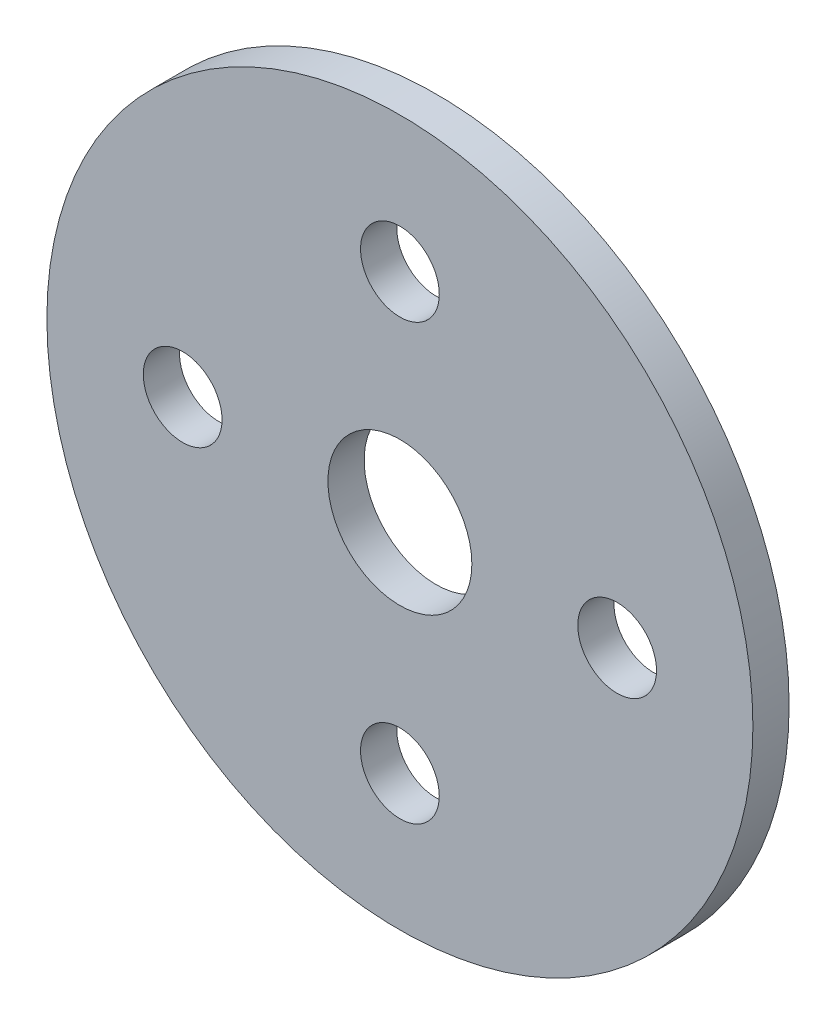
ISO-10303-21;
HEADER;
FILE_DESCRIPTION(('STEP AP214'),'2;1');
FILE_NAME('part.step','',(''),(''),'','','');
FILE_SCHEMA(('AUTOMOTIVE_DESIGN { 1 0 10303 214 1 1 1 1 }'));
ENDSEC;
DATA;
#1=APPLICATION_CONTEXT('core data for automotive mechanical design processes');
#2=APPLICATION_PROTOCOL_DEFINITION('international standard','automotive_design',2000,#1);
#3=PRODUCT_CONTEXT('',#1,'mechanical');
#4=PRODUCT('Part','Part','',(#3));
#5=PRODUCT_RELATED_PRODUCT_CATEGORY('part','',(#4));
#6=PRODUCT_DEFINITION_FORMATION('','',#4);
#7=PRODUCT_DEFINITION_CONTEXT('part definition',#1,'design');
#8=PRODUCT_DEFINITION('design','',#6,#7);
#9=PRODUCT_DEFINITION_SHAPE('','',#8);
#10=(LENGTH_UNIT() NAMED_UNIT(*) SI_UNIT(.MILLI.,.METRE.));
#11=(NAMED_UNIT(*) PLANE_ANGLE_UNIT() SI_UNIT($,.RADIAN.));
#12=(NAMED_UNIT(*) SI_UNIT($,.STERADIAN.) SOLID_ANGLE_UNIT());
#13=UNCERTAINTY_MEASURE_WITH_UNIT(LENGTH_MEASURE(1.E-05),#10,'distance_accuracy_value','');
#14=(GEOMETRIC_REPRESENTATION_CONTEXT(3) GLOBAL_UNCERTAINTY_ASSIGNED_CONTEXT((#13)) GLOBAL_UNIT_ASSIGNED_CONTEXT((#10,
#11,#12)) REPRESENTATION_CONTEXT('',''));
#15=CARTESIAN_POINT('',(0.,0.,0.));
#16=DIRECTION('',(0.,0.,1.));
#17=DIRECTION('',(1.,0.,0.));
#18=AXIS2_PLACEMENT_3D('',#15,#16,#17);
#19=CARTESIAN_POINT('',(0.,0.,2.));
#20=DIRECTION('',(0.,0.,1.));
#21=DIRECTION('',(1.,0.,0.));
#22=AXIS2_PLACEMENT_3D('',#19,#20,#21);
#23=PLANE('',#22);
#24=CARTESIAN_POINT('',(-12.,0.,2.));
#25=DIRECTION('',(0.,0.,1.));
#26=DIRECTION('',(1.,0.,0.));
#27=AXIS2_PLACEMENT_3D('',#24,#25,#26);
#28=CIRCLE('',#27,2.175);
#29=CARTESIAN_POINT('',(-9.825,0.,2.));
#30=VERTEX_POINT('',#29);
#31=EDGE_CURVE('E59',#30,#30,#28,.T.);
#32=ORIENTED_EDGE('',*,*,#31,.F.);
#33=EDGE_LOOP('',(#32));
#34=FACE_BOUND('',#33,.T.);
#35=CARTESIAN_POINT('',(12.,0.,2.));
#36=DIRECTION('',(0.,0.,1.));
#37=DIRECTION('',(1.,0.,0.));
#38=AXIS2_PLACEMENT_3D('',#35,#36,#37);
#39=CIRCLE('',#38,2.175);
#40=CARTESIAN_POINT('',(14.175,0.,2.));
#41=VERTEX_POINT('',#40);
#42=EDGE_CURVE('E47',#41,#41,#39,.T.);
#43=ORIENTED_EDGE('',*,*,#42,.F.);
#44=EDGE_LOOP('',(#43));
#45=FACE_BOUND('',#44,.T.);
#46=CARTESIAN_POINT('',(0.,0.,2.));
#47=DIRECTION('',(0.,0.,1.));
#48=DIRECTION('',(1.,0.,0.));
#49=AXIS2_PLACEMENT_3D('',#46,#47,#48);
#50=CIRCLE('',#49,19.5);
#51=CARTESIAN_POINT('',(19.5,0.,2.));
#52=VERTEX_POINT('',#51);
#53=EDGE_CURVE('E10',#52,#52,#50,.T.);
#54=ORIENTED_EDGE('',*,*,#53,.T.);
#55=EDGE_LOOP('',(#54));
#56=FACE_BOUND('',#55,.T.);
#57=CARTESIAN_POINT('',(0.,0.,2.));
#58=DIRECTION('',(0.,0.,1.));
#59=DIRECTION('',(1.,0.,0.));
#60=AXIS2_PLACEMENT_3D('',#57,#58,#59);
#61=CIRCLE('',#60,3.975);
#62=CARTESIAN_POINT('',(3.975,0.,2.));
#63=VERTEX_POINT('',#62);
#64=EDGE_CURVE('E42',#63,#63,#61,.T.);
#65=ORIENTED_EDGE('',*,*,#64,.F.);
#66=EDGE_LOOP('',(#65));
#67=FACE_BOUND('',#66,.T.);
#68=CARTESIAN_POINT('',(0.,12.,2.));
#69=DIRECTION('',(0.,0.,1.));
#70=DIRECTION('',(1.,0.,0.));
#71=AXIS2_PLACEMENT_3D('',#68,#69,#70);
#72=CIRCLE('',#71,2.175);
#73=CARTESIAN_POINT('',(2.175,12.,2.));
#74=VERTEX_POINT('',#73);
#75=EDGE_CURVE('E53',#74,#74,#72,.T.);
#76=ORIENTED_EDGE('',*,*,#75,.F.);
#77=EDGE_LOOP('',(#76));
#78=FACE_BOUND('',#77,.T.);
#79=CARTESIAN_POINT('',(0.,-12.,2.));
#80=DIRECTION('',(0.,0.,1.));
#81=DIRECTION('',(1.,0.,0.));
#82=AXIS2_PLACEMENT_3D('',#79,#80,#81);
#83=CIRCLE('',#82,2.175);
#84=CARTESIAN_POINT('',(2.175,-12.,2.));
#85=VERTEX_POINT('',#84);
#86=EDGE_CURVE('E65',#85,#85,#83,.T.);
#87=ORIENTED_EDGE('',*,*,#86,.F.);
#88=EDGE_LOOP('',(#87));
#89=FACE_BOUND('',#88,.T.);
#90=ADVANCED_FACE('F31',(#34,#45,#56,#67,#78,#89),#23,.T.);
#91=CARTESIAN_POINT('',(0.,0.,0.));
#92=DIRECTION('',(0.,0.,1.));
#93=DIRECTION('',(1.,0.,0.));
#94=AXIS2_PLACEMENT_3D('',#91,#92,#93);
#95=PLANE('',#94);
#96=CARTESIAN_POINT('',(0.,0.,0.));
#97=DIRECTION('',(0.,0.,1.));
#98=DIRECTION('',(1.,0.,0.));
#99=AXIS2_PLACEMENT_3D('',#96,#97,#98);
#100=CIRCLE('',#99,19.5);
#101=CARTESIAN_POINT('',(19.5,0.,0.));
#102=VERTEX_POINT('',#101);
#103=EDGE_CURVE('E35',#102,#102,#100,.T.);
#104=ORIENTED_EDGE('',*,*,#103,.F.);
#105=EDGE_LOOP('',(#104));
#106=FACE_BOUND('',#105,.T.);
#107=CARTESIAN_POINT('',(0.,0.,0.));
#108=DIRECTION('',(0.,0.,1.));
#109=DIRECTION('',(1.,0.,0.));
#110=AXIS2_PLACEMENT_3D('',#107,#108,#109);
#111=CIRCLE('',#110,3.975);
#112=CARTESIAN_POINT('',(3.975,0.,0.));
#113=VERTEX_POINT('',#112);
#114=EDGE_CURVE('E44',#113,#113,#111,.T.);
#115=ORIENTED_EDGE('',*,*,#114,.T.);
#116=EDGE_LOOP('',(#115));
#117=FACE_BOUND('',#116,.T.);
#118=CARTESIAN_POINT('',(12.,0.,0.));
#119=DIRECTION('',(0.,0.,1.));
#120=DIRECTION('',(1.,0.,0.));
#121=AXIS2_PLACEMENT_3D('',#118,#119,#120);
#122=CIRCLE('',#121,2.175);
#123=CARTESIAN_POINT('',(14.175,0.,0.));
#124=VERTEX_POINT('',#123);
#125=EDGE_CURVE('E50',#124,#124,#122,.T.);
#126=ORIENTED_EDGE('',*,*,#125,.T.);
#127=EDGE_LOOP('',(#126));
#128=FACE_BOUND('',#127,.T.);
#129=CARTESIAN_POINT('',(0.,12.,0.));
#130=DIRECTION('',(0.,0.,1.));
#131=DIRECTION('',(1.,0.,0.));
#132=AXIS2_PLACEMENT_3D('',#129,#130,#131);
#133=CIRCLE('',#132,2.175);
#134=CARTESIAN_POINT('',(2.175,12.,0.));
#135=VERTEX_POINT('',#134);
#136=EDGE_CURVE('E56',#135,#135,#133,.T.);
#137=ORIENTED_EDGE('',*,*,#136,.T.);
#138=EDGE_LOOP('',(#137));
#139=FACE_BOUND('',#138,.T.);
#140=CARTESIAN_POINT('',(-12.,0.,0.));
#141=DIRECTION('',(0.,0.,1.));
#142=DIRECTION('',(1.,0.,0.));
#143=AXIS2_PLACEMENT_3D('',#140,#141,#142);
#144=CIRCLE('',#143,2.175);
#145=CARTESIAN_POINT('',(-9.825,0.,0.));
#146=VERTEX_POINT('',#145);
#147=EDGE_CURVE('E62',#146,#146,#144,.T.);
#148=ORIENTED_EDGE('',*,*,#147,.T.);
#149=EDGE_LOOP('',(#148));
#150=FACE_BOUND('',#149,.T.);
#151=CARTESIAN_POINT('',(0.,-12.,0.));
#152=DIRECTION('',(0.,0.,1.));
#153=DIRECTION('',(1.,0.,0.));
#154=AXIS2_PLACEMENT_3D('',#151,#152,#153);
#155=CIRCLE('',#154,2.175);
#156=CARTESIAN_POINT('',(2.175,-12.,0.));
#157=VERTEX_POINT('',#156);
#158=EDGE_CURVE('E68',#157,#157,#155,.T.);
#159=ORIENTED_EDGE('',*,*,#158,.T.);
#160=EDGE_LOOP('',(#159));
#161=FACE_BOUND('',#160,.T.);
#162=ADVANCED_FACE('F78',(#106,#117,#128,#139,#150,#161),#95,.F.);
#163=CARTESIAN_POINT('',(0.,0.,2.));
#164=DIRECTION('',(0.,0.,-1.));
#165=DIRECTION('',(-1.,0.,0.));
#166=AXIS2_PLACEMENT_3D('',#163,#164,#165);
#167=CYLINDRICAL_SURFACE('',#166,19.5);
#168=ORIENTED_EDGE('',*,*,#53,.F.);
#169=EDGE_LOOP('',(#168));
#170=FACE_BOUND('',#169,.T.);
#171=ORIENTED_EDGE('',*,*,#103,.T.);
#172=EDGE_LOOP('',(#171));
#173=FACE_BOUND('',#172,.T.);
#174=ADVANCED_FACE('F33',(#170,#173),#167,.T.);
#175=CARTESIAN_POINT('',(0.,0.,2.));
#176=DIRECTION('',(0.,0.,-1.));
#177=DIRECTION('',(-1.,0.,0.));
#178=AXIS2_PLACEMENT_3D('',#175,#176,#177);
#179=CYLINDRICAL_SURFACE('',#178,3.975);
#180=ORIENTED_EDGE('',*,*,#64,.T.);
#181=EDGE_LOOP('',(#180));
#182=FACE_BOUND('',#181,.T.);
#183=ORIENTED_EDGE('',*,*,#114,.F.);
#184=EDGE_LOOP('',(#183));
#185=FACE_BOUND('',#184,.T.);
#186=ADVANCED_FACE('F88',(#182,#185),#179,.F.);
#187=CARTESIAN_POINT('',(12.,0.,2.));
#188=DIRECTION('',(0.,0.,-1.));
#189=DIRECTION('',(-1.,0.,0.));
#190=AXIS2_PLACEMENT_3D('',#187,#188,#189);
#191=CYLINDRICAL_SURFACE('',#190,2.175);
#192=ORIENTED_EDGE('',*,*,#42,.T.);
#193=EDGE_LOOP('',(#192));
#194=FACE_BOUND('',#193,.T.);
#195=ORIENTED_EDGE('',*,*,#125,.F.);
#196=EDGE_LOOP('',(#195));
#197=FACE_BOUND('',#196,.T.);
#198=ADVANCED_FACE('F91',(#194,#197),#191,.F.);
#199=CARTESIAN_POINT('',(0.,12.,2.));
#200=DIRECTION('',(0.,0.,-1.));
#201=DIRECTION('',(-1.,0.,0.));
#202=AXIS2_PLACEMENT_3D('',#199,#200,#201);
#203=CYLINDRICAL_SURFACE('',#202,2.175);
#204=ORIENTED_EDGE('',*,*,#75,.T.);
#205=EDGE_LOOP('',(#204));
#206=FACE_BOUND('',#205,.T.);
#207=ORIENTED_EDGE('',*,*,#136,.F.);
#208=EDGE_LOOP('',(#207));
#209=FACE_BOUND('',#208,.T.);
#210=ADVANCED_FACE('F95',(#206,#209),#203,.F.);
#211=CARTESIAN_POINT('',(-12.,0.,2.));
#212=DIRECTION('',(0.,0.,-1.));
#213=DIRECTION('',(-1.,0.,0.));
#214=AXIS2_PLACEMENT_3D('',#211,#212,#213);
#215=CYLINDRICAL_SURFACE('',#214,2.175);
#216=ORIENTED_EDGE('',*,*,#31,.T.);
#217=EDGE_LOOP('',(#216));
#218=FACE_BOUND('',#217,.T.);
#219=ORIENTED_EDGE('',*,*,#147,.F.);
#220=EDGE_LOOP('',(#219));
#221=FACE_BOUND('',#220,.T.);
#222=ADVANCED_FACE('F99',(#218,#221),#215,.F.);
#223=CARTESIAN_POINT('',(0.,-12.,2.));
#224=DIRECTION('',(0.,0.,-1.));
#225=DIRECTION('',(-1.,0.,0.));
#226=AXIS2_PLACEMENT_3D('',#223,#224,#225);
#227=CYLINDRICAL_SURFACE('',#226,2.175);
#228=ORIENTED_EDGE('',*,*,#86,.T.);
#229=EDGE_LOOP('',(#228));
#230=FACE_BOUND('',#229,.T.);
#231=ORIENTED_EDGE('',*,*,#158,.F.);
#232=EDGE_LOOP('',(#231));
#233=FACE_BOUND('',#232,.T.);
#234=ADVANCED_FACE('F74',(#230,#233),#227,.F.);
#235=CLOSED_SHELL('',(#90,#162,#174,#186,#198,#210,#222,#234));
#236=MANIFOLD_SOLID_BREP('B2',#235);
#237=ADVANCED_BREP_SHAPE_REPRESENTATION('',(#18,#236),#14);
#238=SHAPE_DEFINITION_REPRESENTATION(#9,#237);
ENDSEC;
END-ISO-10303-21;
